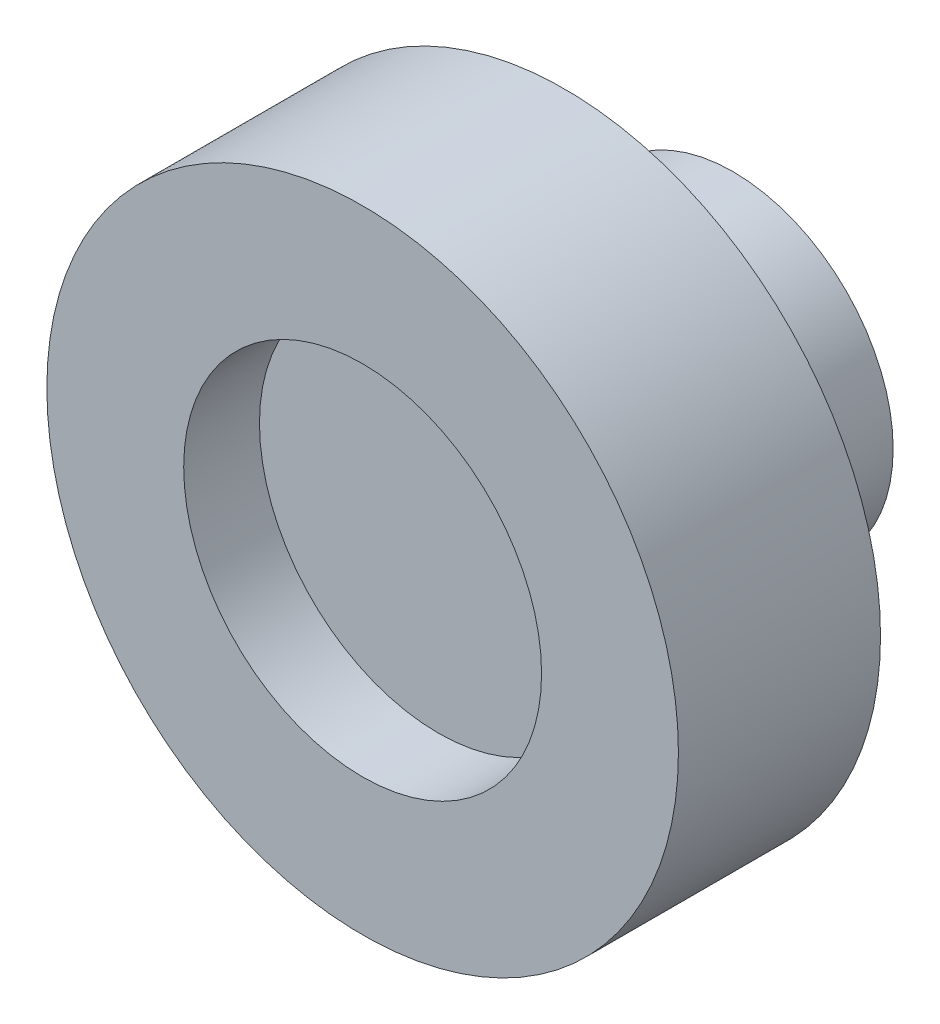
ISO-10303-21;
HEADER;
FILE_DESCRIPTION(('STEP AP214'),'2;1');
FILE_NAME('part.step','',(''),(''),'','','');
FILE_SCHEMA(('AUTOMOTIVE_DESIGN { 1 0 10303 214 1 1 1 1 }'));
ENDSEC;
DATA;
#1=APPLICATION_CONTEXT('core data for automotive mechanical design processes');
#2=APPLICATION_PROTOCOL_DEFINITION('international standard','automotive_design',2000,#1);
#3=PRODUCT_CONTEXT('',#1,'mechanical');
#4=PRODUCT('Part','Part','',(#3));
#5=PRODUCT_RELATED_PRODUCT_CATEGORY('part','',(#4));
#6=PRODUCT_DEFINITION_FORMATION('','',#4);
#7=PRODUCT_DEFINITION_CONTEXT('part definition',#1,'design');
#8=PRODUCT_DEFINITION('design','',#6,#7);
#9=PRODUCT_DEFINITION_SHAPE('','',#8);
#10=(LENGTH_UNIT() NAMED_UNIT(*) SI_UNIT(.MILLI.,.METRE.));
#11=(NAMED_UNIT(*) PLANE_ANGLE_UNIT() SI_UNIT($,.RADIAN.));
#12=(NAMED_UNIT(*) SI_UNIT($,.STERADIAN.) SOLID_ANGLE_UNIT());
#13=UNCERTAINTY_MEASURE_WITH_UNIT(LENGTH_MEASURE(1.E-05),#10,'distance_accuracy_value','');
#14=(GEOMETRIC_REPRESENTATION_CONTEXT(3) GLOBAL_UNCERTAINTY_ASSIGNED_CONTEXT((#13)) GLOBAL_UNIT_ASSIGNED_CONTEXT((#10,
#11,#12)) REPRESENTATION_CONTEXT('',''));
#15=CARTESIAN_POINT('',(0.,0.,0.));
#16=DIRECTION('',(0.,0.,1.));
#17=DIRECTION('',(1.,0.,0.));
#18=AXIS2_PLACEMENT_3D('',#15,#16,#17);
#19=CARTESIAN_POINT('',(0.,0.,3.));
#20=DIRECTION('',(0.,0.,-1.));
#21=DIRECTION('',(-1.,0.,0.));
#22=AXIS2_PLACEMENT_3D('',#19,#20,#21);
#23=CYLINDRICAL_SURFACE('',#22,7.5);
#24=CARTESIAN_POINT('',(0.,0.,0.));
#25=DIRECTION('',(0.,0.,1.));
#26=DIRECTION('',(1.,0.,0.));
#27=AXIS2_PLACEMENT_3D('',#24,#25,#26);
#28=CIRCLE('',#27,7.5);
#29=CARTESIAN_POINT('',(7.5,0.,0.));
#30=VERTEX_POINT('',#29);
#31=EDGE_CURVE('E47',#30,#30,#28,.T.);
#32=ORIENTED_EDGE('',*,*,#31,.T.);
#33=EDGE_LOOP('',(#32));
#34=FACE_BOUND('',#33,.T.);
#35=CARTESIAN_POINT('',(0.,0.,4.8));
#36=DIRECTION('',(0.,0.,1.));
#37=DIRECTION('',(1.,0.,0.));
#38=AXIS2_PLACEMENT_3D('',#35,#36,#37);
#39=CIRCLE('',#38,7.5);
#40=CARTESIAN_POINT('',(7.5,0.,4.8));
#41=VERTEX_POINT('',#40);
#42=EDGE_CURVE('E56',#41,#41,#39,.T.);
#43=ORIENTED_EDGE('',*,*,#42,.F.);
#44=EDGE_LOOP('',(#43));
#45=FACE_BOUND('',#44,.T.);
#46=ADVANCED_FACE('F37',(#34,#45),#23,.T.);
#47=CARTESIAN_POINT('',(0.,0.,0.));
#48=DIRECTION('',(0.,0.,1.));
#49=DIRECTION('',(1.,0.,0.));
#50=AXIS2_PLACEMENT_3D('',#47,#48,#49);
#51=PLANE('',#50);
#52=CARTESIAN_POINT('',(0.,0.,0.));
#53=DIRECTION('',(0.,0.,-1.));
#54=DIRECTION('',(-1.,0.,0.));
#55=AXIS2_PLACEMENT_3D('',#52,#53,#54);
#56=CIRCLE('',#55,3.8);
#57=CARTESIAN_POINT('',(-3.8,0.,0.));
#58=VERTEX_POINT('',#57);
#59=EDGE_CURVE('E43',#58,#58,#56,.T.);
#60=ORIENTED_EDGE('',*,*,#59,.F.);
#61=EDGE_LOOP('',(#60));
#62=FACE_BOUND('',#61,.T.);
#63=ORIENTED_EDGE('',*,*,#31,.F.);
#64=EDGE_LOOP('',(#63));
#65=FACE_BOUND('',#64,.T.);
#66=ADVANCED_FACE('F80',(#62,#65),#51,.F.);
#67=CARTESIAN_POINT('',(0.,0.,-4.));
#68=DIRECTION('',(0.,0.,1.));
#69=DIRECTION('',(1.,0.,0.));
#70=AXIS2_PLACEMENT_3D('',#67,#68,#69);
#71=CYLINDRICAL_SURFACE('',#70,3.8);
#72=CARTESIAN_POINT('',(0.,0.,-4.));
#73=DIRECTION('',(0.,0.,-1.));
#74=DIRECTION('',(-1.,0.,0.));
#75=AXIS2_PLACEMENT_3D('',#72,#73,#74);
#76=CIRCLE('',#75,3.8);
#77=CARTESIAN_POINT('',(-3.8,0.,-4.));
#78=VERTEX_POINT('',#77);
#79=EDGE_CURVE('E52',#78,#78,#76,.T.);
#80=ORIENTED_EDGE('',*,*,#79,.F.);
#81=EDGE_LOOP('',(#80));
#82=FACE_BOUND('',#81,.T.);
#83=ORIENTED_EDGE('',*,*,#59,.T.);
#84=EDGE_LOOP('',(#83));
#85=FACE_BOUND('',#84,.T.);
#86=ADVANCED_FACE('F77',(#82,#85),#71,.T.);
#87=CARTESIAN_POINT('',(0.,0.,-4.));
#88=DIRECTION('',(0.,0.,-1.));
#89=DIRECTION('',(-1.,0.,0.));
#90=AXIS2_PLACEMENT_3D('',#87,#88,#89);
#91=PLANE('',#90);
#92=ORIENTED_EDGE('',*,*,#79,.T.);
#93=EDGE_LOOP('',(#92));
#94=FACE_BOUND('',#93,.T.);
#95=ADVANCED_FACE('F67',(#94),#91,.T.);
#96=CARTESIAN_POINT('',(0.,0.,4.8));
#97=DIRECTION('',(0.,0.,1.));
#98=DIRECTION('',(1.,0.,0.));
#99=AXIS2_PLACEMENT_3D('',#96,#97,#98);
#100=PLANE('',#99);
#101=ORIENTED_EDGE('',*,*,#42,.T.);
#102=EDGE_LOOP('',(#101));
#103=FACE_BOUND('',#102,.T.);
#104=CARTESIAN_POINT('',(0.,0.,4.8));
#105=DIRECTION('',(0.,0.,1.));
#106=DIRECTION('',(1.,0.,0.));
#107=AXIS2_PLACEMENT_3D('',#104,#105,#106);
#108=CIRCLE('',#107,4.25);
#109=CARTESIAN_POINT('',(4.25,0.,4.8));
#110=VERTEX_POINT('',#109);
#111=EDGE_CURVE('E59',#110,#110,#108,.T.);
#112=ORIENTED_EDGE('',*,*,#111,.F.);
#113=EDGE_LOOP('',(#112));
#114=FACE_BOUND('',#113,.T.);
#115=ADVANCED_FACE('F65',(#103,#114),#100,.T.);
#116=CARTESIAN_POINT('',(0.,0.,4.8));
#117=DIRECTION('',(0.,0.,-1.));
#118=DIRECTION('',(-1.,0.,0.));
#119=AXIS2_PLACEMENT_3D('',#116,#117,#118);
#120=CYLINDRICAL_SURFACE('',#119,4.25);
#121=ORIENTED_EDGE('',*,*,#111,.T.);
#122=EDGE_LOOP('',(#121));
#123=FACE_BOUND('',#122,.T.);
#124=CARTESIAN_POINT('',(0.,0.,3.));
#125=DIRECTION('',(0.,0.,1.));
#126=DIRECTION('',(1.,0.,0.));
#127=AXIS2_PLACEMENT_3D('',#124,#125,#126);
#128=CIRCLE('',#127,4.25);
#129=CARTESIAN_POINT('',(4.25,0.,3.));
#130=VERTEX_POINT('',#129);
#131=EDGE_CURVE('E10',#130,#130,#128,.F.);
#132=ORIENTED_EDGE('',*,*,#131,.T.);
#133=EDGE_LOOP('',(#132));
#134=FACE_BOUND('',#133,.T.);
#135=ADVANCED_FACE('F63',(#123,#134),#120,.F.);
#136=CARTESIAN_POINT('',(0.,0.,3.));
#137=DIRECTION('',(0.,0.,1.));
#138=DIRECTION('',(1.,0.,0.));
#139=AXIS2_PLACEMENT_3D('',#136,#137,#138);
#140=PLANE('',#139);
#141=ORIENTED_EDGE('',*,*,#131,.F.);
#142=EDGE_LOOP('',(#141));
#143=FACE_BOUND('',#142,.T.);
#144=ADVANCED_FACE('F74',(#143),#140,.T.);
#145=CLOSED_SHELL('',(#46,#66,#86,#95,#115,#135,#144));
#146=MANIFOLD_SOLID_BREP('B2',#145);
#147=ADVANCED_BREP_SHAPE_REPRESENTATION('',(#18,#146),#14);
#148=SHAPE_DEFINITION_REPRESENTATION(#9,#147);
ENDSEC;
END-ISO-10303-21;
